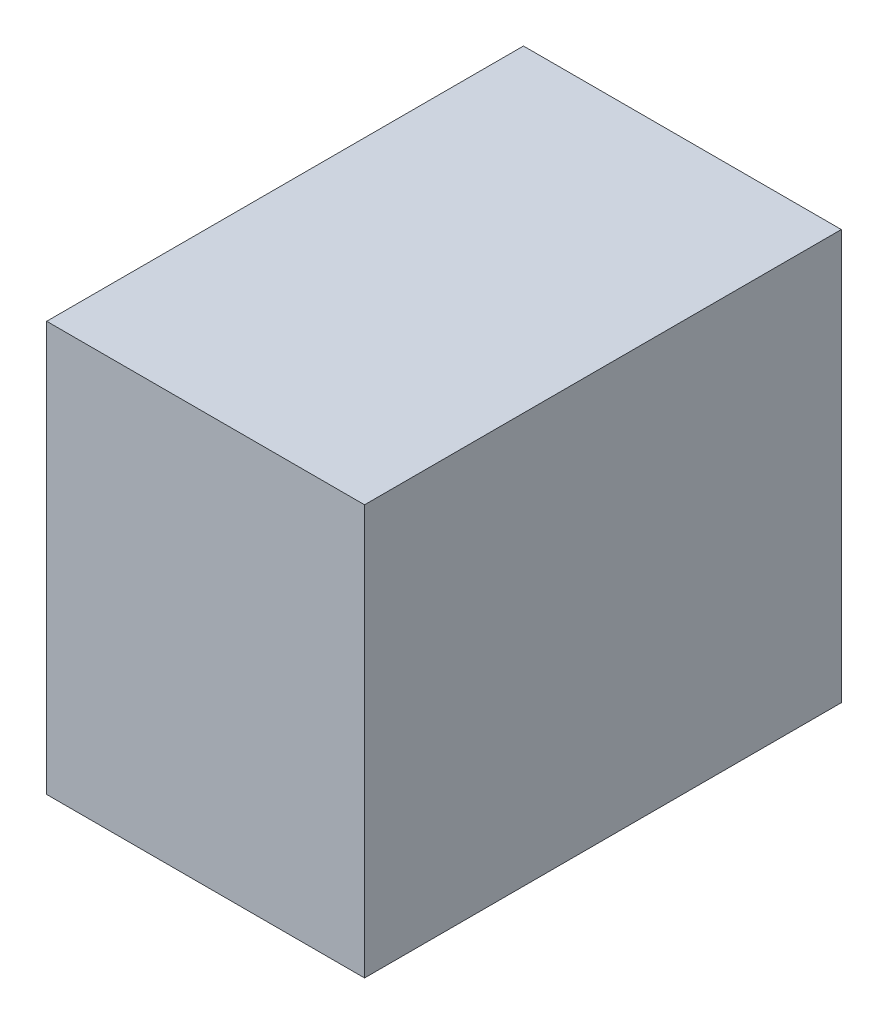
ISO-10303-21;
HEADER;
FILE_DESCRIPTION(('STEP AP214'),'2;1');
FILE_NAME('part.step','',(''),(''),'','','');
FILE_SCHEMA(('AUTOMOTIVE_DESIGN { 1 0 10303 214 1 1 1 1 }'));
ENDSEC;
DATA;
#1=APPLICATION_CONTEXT('core data for automotive mechanical design processes');
#2=APPLICATION_PROTOCOL_DEFINITION('international standard','automotive_design',2000,#1);
#3=PRODUCT_CONTEXT('',#1,'mechanical');
#4=PRODUCT('Part','Part','',(#3));
#5=PRODUCT_RELATED_PRODUCT_CATEGORY('part','',(#4));
#6=PRODUCT_DEFINITION_FORMATION('','',#4);
#7=PRODUCT_DEFINITION_CONTEXT('part definition',#1,'design');
#8=PRODUCT_DEFINITION('design','',#6,#7);
#9=PRODUCT_DEFINITION_SHAPE('','',#8);
#10=(LENGTH_UNIT() NAMED_UNIT(*) SI_UNIT(.MILLI.,.METRE.));
#11=(NAMED_UNIT(*) PLANE_ANGLE_UNIT() SI_UNIT($,.RADIAN.));
#12=(NAMED_UNIT(*) SI_UNIT($,.STERADIAN.) SOLID_ANGLE_UNIT());
#13=UNCERTAINTY_MEASURE_WITH_UNIT(LENGTH_MEASURE(1.E-05),#10,'distance_accuracy_value','');
#14=(GEOMETRIC_REPRESENTATION_CONTEXT(3) GLOBAL_UNCERTAINTY_ASSIGNED_CONTEXT((#13)) GLOBAL_UNIT_ASSIGNED_CONTEXT((#10,
#11,#12)) REPRESENTATION_CONTEXT('',''));
#15=CARTESIAN_POINT('',(0.,0.,0.));
#16=DIRECTION('',(0.,0.,1.));
#17=DIRECTION('',(1.,0.,0.));
#18=AXIS2_PLACEMENT_3D('',#15,#16,#17);
#19=CARTESIAN_POINT('',(0.50804826,-0.65499996,0.));
#20=DIRECTION('',(-1.,0.,0.));
#21=DIRECTION('',(0.,0.,1.));
#22=AXIS2_PLACEMENT_3D('',#19,#20,#21);
#23=PLANE('',#22);
#24=DIRECTION('',(0.,0.,-1.));
#25=VECTOR('',#24,1.);
#26=CARTESIAN_POINT('',(0.50804826,0.65499996,0.));
#27=LINE('',#26,#25);
#28=CARTESIAN_POINT('',(0.50804826,0.65499996,0.));
#29=VERTEX_POINT('',#28);
#30=CARTESIAN_POINT('',(0.50804826,0.65499996,1.524));
#31=VERTEX_POINT('',#30);
#32=EDGE_CURVE('E20',#29,#31,#27,.F.);
#33=ORIENTED_EDGE('',*,*,#32,.T.);
#34=DIRECTION('',(0.,1.,0.));
#35=VECTOR('',#34,1.);
#36=CARTESIAN_POINT('',(0.50804826,0.65499996,1.524));
#37=LINE('',#36,#35);
#38=CARTESIAN_POINT('',(0.50804826,-0.65499996,1.524));
#39=VERTEX_POINT('',#38);
#40=EDGE_CURVE('E55',#31,#39,#37,.F.);
#41=ORIENTED_EDGE('',*,*,#40,.T.);
#42=DIRECTION('',(0.,0.,1.));
#43=VECTOR('',#42,1.);
#44=CARTESIAN_POINT('',(0.50804826,-0.65499996,0.));
#45=LINE('',#44,#43);
#46=CARTESIAN_POINT('',(0.50804826,-0.65499996,0.));
#47=VERTEX_POINT('',#46);
#48=EDGE_CURVE('E76',#39,#47,#45,.F.);
#49=ORIENTED_EDGE('',*,*,#48,.T.);
#50=DIRECTION('',(0.,1.,0.));
#51=VECTOR('',#50,1.);
#52=CARTESIAN_POINT('',(0.50804826,0.65499996,0.));
#53=LINE('',#52,#51);
#54=EDGE_CURVE('E58',#29,#47,#53,.F.);
#55=ORIENTED_EDGE('',*,*,#54,.F.);
#56=EDGE_LOOP('',(#33,#41,#49,#55));
#57=FACE_BOUND('',#56,.T.);
#58=ADVANCED_FACE('F17',(#57),#23,.F.);
#59=CARTESIAN_POINT('',(0.50804826,0.65499996,0.));
#60=DIRECTION('',(0.,-1.,0.));
#61=DIRECTION('',(0.,0.,-1.));
#62=AXIS2_PLACEMENT_3D('',#59,#60,#61);
#63=PLANE('',#62);
#64=DIRECTION('',(0.,0.,-1.));
#65=VECTOR('',#64,1.);
#66=CARTESIAN_POINT('',(-0.50804826,0.65499996,0.));
#67=LINE('',#66,#65);
#68=CARTESIAN_POINT('',(-0.50804826,0.65499996,0.));
#69=VERTEX_POINT('',#68);
#70=CARTESIAN_POINT('',(-0.50804826,0.65499996,1.524));
#71=VERTEX_POINT('',#70);
#72=EDGE_CURVE('E73',#69,#71,#67,.F.);
#73=ORIENTED_EDGE('',*,*,#72,.T.);
#74=DIRECTION('',(-1.,0.,0.));
#75=VECTOR('',#74,1.);
#76=CARTESIAN_POINT('',(-0.50804826,0.65499996,1.524));
#77=LINE('',#76,#75);
#78=EDGE_CURVE('E63',#71,#31,#77,.F.);
#79=ORIENTED_EDGE('',*,*,#78,.T.);
#80=ORIENTED_EDGE('',*,*,#32,.F.);
#81=DIRECTION('',(-1.,0.,0.));
#82=VECTOR('',#81,1.);
#83=CARTESIAN_POINT('',(-0.50804826,0.65499996,0.));
#84=LINE('',#83,#82);
#85=EDGE_CURVE('E78',#69,#29,#84,.F.);
#86=ORIENTED_EDGE('',*,*,#85,.F.);
#87=EDGE_LOOP('',(#73,#79,#80,#86));
#88=FACE_BOUND('',#87,.T.);
#89=ADVANCED_FACE('F72',(#88),#63,.F.);
#90=CARTESIAN_POINT('',(-0.50804826,0.65499996,1.524));
#91=DIRECTION('',(0.,0.,-1.));
#92=DIRECTION('',(-1.,0.,0.));
#93=AXIS2_PLACEMENT_3D('',#90,#91,#92);
#94=PLANE('',#93);
#95=DIRECTION('',(1.,0.,0.));
#96=VECTOR('',#95,1.);
#97=CARTESIAN_POINT('',(-0.50804826,-0.65499996,1.524));
#98=LINE('',#97,#96);
#99=CARTESIAN_POINT('',(-0.50804826,-0.65499996,1.524));
#100=VERTEX_POINT('',#99);
#101=EDGE_CURVE('E69',#100,#39,#98,.T.);
#102=ORIENTED_EDGE('',*,*,#101,.T.);
#103=ORIENTED_EDGE('',*,*,#40,.F.);
#104=ORIENTED_EDGE('',*,*,#78,.F.);
#105=DIRECTION('',(0.,1.,0.));
#106=VECTOR('',#105,1.);
#107=CARTESIAN_POINT('',(-0.50804826,0.65499996,1.524));
#108=LINE('',#107,#106);
#109=EDGE_CURVE('E83',#71,#100,#108,.F.);
#110=ORIENTED_EDGE('',*,*,#109,.T.);
#111=EDGE_LOOP('',(#102,#103,#104,#110));
#112=FACE_BOUND('',#111,.T.);
#113=ADVANCED_FACE('F66',(#112),#94,.F.);
#114=CARTESIAN_POINT('',(-0.50804826,-0.65499996,0.));
#115=DIRECTION('',(0.,1.,0.));
#116=DIRECTION('',(0.,0.,1.));
#117=AXIS2_PLACEMENT_3D('',#114,#115,#116);
#118=PLANE('',#117);
#119=ORIENTED_EDGE('',*,*,#48,.F.);
#120=ORIENTED_EDGE('',*,*,#101,.F.);
#121=DIRECTION('',(0.,0.,-1.));
#122=VECTOR('',#121,1.);
#123=CARTESIAN_POINT('',(-0.50804826,-0.65499996,0.));
#124=LINE('',#123,#122);
#125=CARTESIAN_POINT('',(-0.50804826,-0.65499996,0.));
#126=VERTEX_POINT('',#125);
#127=EDGE_CURVE('E26',#100,#126,#124,.T.);
#128=ORIENTED_EDGE('',*,*,#127,.T.);
#129=DIRECTION('',(-1.,0.,0.));
#130=VECTOR('',#129,1.);
#131=CARTESIAN_POINT('',(-0.50804826,-0.65499996,0.));
#132=LINE('',#131,#130);
#133=EDGE_CURVE('E34',#47,#126,#132,.T.);
#134=ORIENTED_EDGE('',*,*,#133,.F.);
#135=EDGE_LOOP('',(#119,#120,#128,#134));
#136=FACE_BOUND('',#135,.T.);
#137=ADVANCED_FACE('F88',(#136),#118,.F.);
#138=CARTESIAN_POINT('',(-0.50804826,0.65499996,0.));
#139=DIRECTION('',(0.,0.,-1.));
#140=DIRECTION('',(-1.,0.,0.));
#141=AXIS2_PLACEMENT_3D('',#138,#139,#140);
#142=PLANE('',#141);
#143=ORIENTED_EDGE('',*,*,#133,.T.);
#144=DIRECTION('',(0.,1.,0.));
#145=VECTOR('',#144,1.);
#146=CARTESIAN_POINT('',(-0.50804826,0.65499996,0.));
#147=LINE('',#146,#145);
#148=EDGE_CURVE('E11',#126,#69,#147,.T.);
#149=ORIENTED_EDGE('',*,*,#148,.T.);
#150=ORIENTED_EDGE('',*,*,#85,.T.);
#151=ORIENTED_EDGE('',*,*,#54,.T.);
#152=EDGE_LOOP('',(#143,#149,#150,#151));
#153=FACE_BOUND('',#152,.T.);
#154=ADVANCED_FACE('F91',(#153),#142,.T.);
#155=CARTESIAN_POINT('',(-0.50804826,0.65499996,0.));
#156=DIRECTION('',(1.,0.,0.));
#157=DIRECTION('',(0.,0.,-1.));
#158=AXIS2_PLACEMENT_3D('',#155,#156,#157);
#159=PLANE('',#158);
#160=ORIENTED_EDGE('',*,*,#127,.F.);
#161=ORIENTED_EDGE('',*,*,#109,.F.);
#162=ORIENTED_EDGE('',*,*,#72,.F.);
#163=ORIENTED_EDGE('',*,*,#148,.F.);
#164=EDGE_LOOP('',(#160,#161,#162,#163));
#165=FACE_BOUND('',#164,.T.);
#166=ADVANCED_FACE('F90',(#165),#159,.F.);
#167=CLOSED_SHELL('',(#58,#89,#113,#137,#154,#166));
#168=MANIFOLD_SOLID_BREP('B1',#167);
#169=ADVANCED_BREP_SHAPE_REPRESENTATION('',(#18,#168),#14);
#170=SHAPE_DEFINITION_REPRESENTATION(#9,#169);
ENDSEC;
END-ISO-10303-21;
